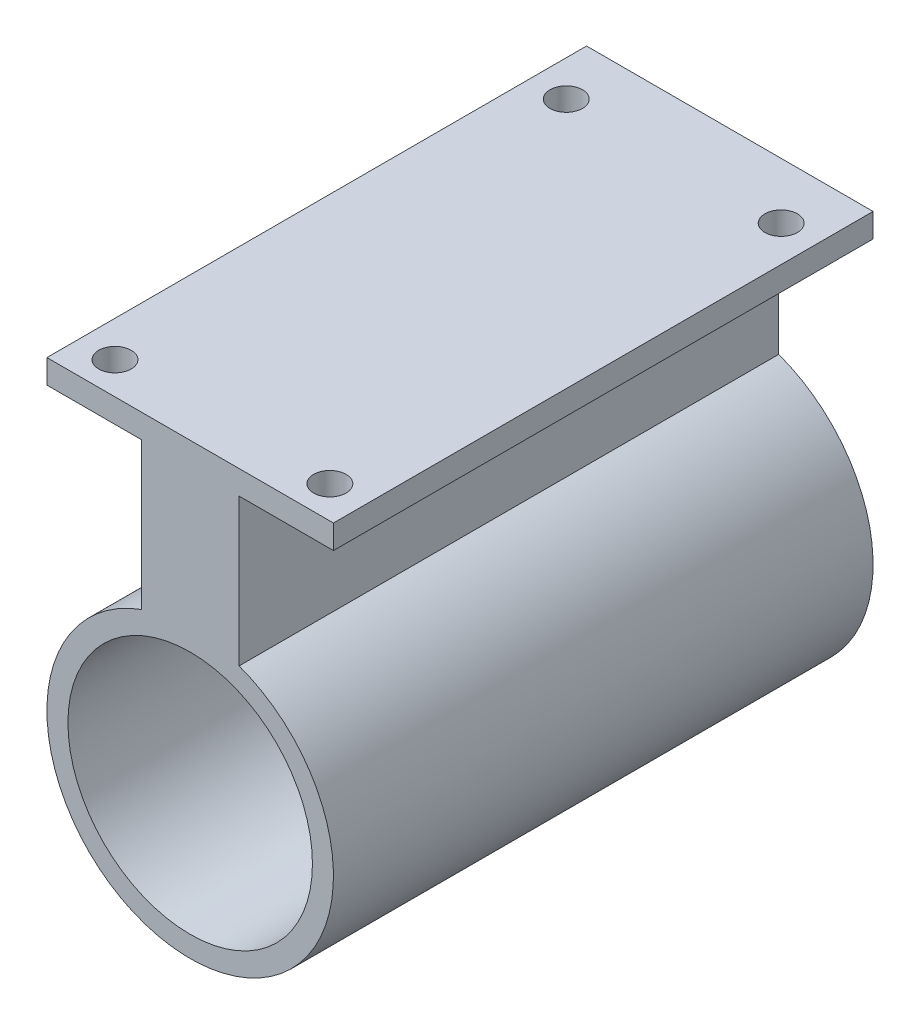
ISO-10303-21;
HEADER;
FILE_DESCRIPTION(('STEP AP214'),'2;1');
FILE_NAME('part.step','',(''),(''),'','','');
FILE_SCHEMA(('AUTOMOTIVE_DESIGN { 1 0 10303 214 1 1 1 1 }'));
ENDSEC;
DATA;
#1=APPLICATION_CONTEXT('core data for automotive mechanical design processes');
#2=APPLICATION_PROTOCOL_DEFINITION('international standard','automotive_design',2000,#1);
#3=PRODUCT_CONTEXT('',#1,'mechanical');
#4=PRODUCT('Part','Part','',(#3));
#5=PRODUCT_RELATED_PRODUCT_CATEGORY('part','',(#4));
#6=PRODUCT_DEFINITION_FORMATION('','',#4);
#7=PRODUCT_DEFINITION_CONTEXT('part definition',#1,'design');
#8=PRODUCT_DEFINITION('design','',#6,#7);
#9=PRODUCT_DEFINITION_SHAPE('','',#8);
#10=(LENGTH_UNIT() NAMED_UNIT(*) SI_UNIT(.MILLI.,.METRE.));
#11=(NAMED_UNIT(*) PLANE_ANGLE_UNIT() SI_UNIT($,.RADIAN.));
#12=(NAMED_UNIT(*) SI_UNIT($,.STERADIAN.) SOLID_ANGLE_UNIT());
#13=UNCERTAINTY_MEASURE_WITH_UNIT(LENGTH_MEASURE(1.E-05),#10,'distance_accuracy_value','');
#14=(GEOMETRIC_REPRESENTATION_CONTEXT(3) GLOBAL_UNCERTAINTY_ASSIGNED_CONTEXT((#13)) GLOBAL_UNIT_ASSIGNED_CONTEXT((#10,
#11,#12)) REPRESENTATION_CONTEXT('',''));
#15=CARTESIAN_POINT('',(0.,0.,0.));
#16=DIRECTION('',(0.,0.,1.));
#17=DIRECTION('',(1.,0.,0.));
#18=AXIS2_PLACEMENT_3D('',#15,#16,#17);
#19=CARTESIAN_POINT('',(0.,-30.75,54.));
#20=DIRECTION('',(0.,0.,-1.));
#21=DIRECTION('',(-1.,0.,0.));
#22=AXIS2_PLACEMENT_3D('',#19,#20,#21);
#23=CYLINDRICAL_SURFACE('',#22,15.);
#24=CARTESIAN_POINT('',(0.,-30.75,-2.5));
#25=DIRECTION('',(0.,0.,-1.));
#26=DIRECTION('',(-1.,0.,0.));
#27=AXIS2_PLACEMENT_3D('',#24,#25,#26);
#28=CIRCLE('',#27,15.);
#29=CARTESIAN_POINT('',(5.11989742878924,-16.6508280271969,-2.5));
#30=VERTEX_POINT('',#29);
#31=CARTESIAN_POINT('',(-5.11989742878925,-16.6508280271969,-2.5));
#32=VERTEX_POINT('',#31);
#33=EDGE_CURVE('E148',#30,#32,#28,.T.);
#34=ORIENTED_EDGE('',*,*,#33,.F.);
#35=DIRECTION('',(0.,0.,-1.));
#36=VECTOR('',#35,1.);
#37=CARTESIAN_POINT('',(5.11989742878925,-16.6508280271969,54.));
#38=LINE('',#37,#36);
#39=CARTESIAN_POINT('',(5.11989742878925,-16.6508280271969,54.));
#40=VERTEX_POINT('',#39);
#41=EDGE_CURVE('E49',#40,#30,#38,.T.);
#42=ORIENTED_EDGE('',*,*,#41,.F.);
#43=CARTESIAN_POINT('',(0.,-30.75,54.));
#44=DIRECTION('',(0.,0.,1.));
#45=DIRECTION('',(1.,0.,0.));
#46=AXIS2_PLACEMENT_3D('',#43,#44,#45);
#47=CIRCLE('',#46,15.);
#48=CARTESIAN_POINT('',(-5.11989742878925,-16.6508280271969,54.));
#49=VERTEX_POINT('',#48);
#50=EDGE_CURVE('E158',#49,#40,#47,.T.);
#51=ORIENTED_EDGE('',*,*,#50,.F.);
#52=DIRECTION('',(0.,0.,-1.));
#53=VECTOR('',#52,1.);
#54=CARTESIAN_POINT('',(-5.11989742878925,-16.6508280271969,54.));
#55=LINE('',#54,#53);
#56=EDGE_CURVE('E170',#49,#32,#55,.T.);
#57=ORIENTED_EDGE('',*,*,#56,.T.);
#58=EDGE_LOOP('',(#34,#42,#51,#57));
#59=FACE_BOUND('',#58,.T.);
#60=ADVANCED_FACE('F32',(#59),#23,.T.);
#61=CARTESIAN_POINT('',(0.,-30.75,54.));
#62=DIRECTION('',(0.,0.,1.));
#63=DIRECTION('',(1.,0.,0.));
#64=AXIS2_PLACEMENT_3D('',#61,#62,#63);
#65=PLANE('',#64);
#66=CARTESIAN_POINT('',(0.,-30.75,54.));
#67=DIRECTION('',(0.,0.,1.));
#68=DIRECTION('',(1.,0.,0.));
#69=AXIS2_PLACEMENT_3D('',#66,#67,#68);
#70=CIRCLE('',#69,12.8);
#71=CARTESIAN_POINT('',(12.8,-30.75,54.));
#72=VERTEX_POINT('',#71);
#73=EDGE_CURVE('E130',#72,#72,#70,.T.);
#74=ORIENTED_EDGE('',*,*,#73,.F.);
#75=EDGE_LOOP('',(#74));
#76=FACE_BOUND('',#75,.T.);
#77=DIRECTION('',(0.,-1.,0.));
#78=VECTOR('',#77,1.);
#79=CARTESIAN_POINT('',(-15.,-1.25,54.));
#80=LINE('',#79,#78);
#81=CARTESIAN_POINT('',(-15.,1.25,54.));
#82=VERTEX_POINT('',#81);
#83=CARTESIAN_POINT('',(-15.,-1.25,54.));
#84=VERTEX_POINT('',#83);
#85=EDGE_CURVE('E152',#82,#84,#80,.T.);
#86=ORIENTED_EDGE('',*,*,#85,.T.);
#87=DIRECTION('',(1.,0.,0.));
#88=VECTOR('',#87,1.);
#89=CARTESIAN_POINT('',(-5.11989742878925,-1.25,54.));
#90=LINE('',#89,#88);
#91=CARTESIAN_POINT('',(-5.11989742878925,-1.25,54.));
#92=VERTEX_POINT('',#91);
#93=EDGE_CURVE('E154',#84,#92,#90,.T.);
#94=ORIENTED_EDGE('',*,*,#93,.T.);
#95=DIRECTION('',(0.,-1.,0.));
#96=VECTOR('',#95,1.);
#97=CARTESIAN_POINT('',(-5.11989742878925,-13.25,54.));
#98=LINE('',#97,#96);
#99=EDGE_CURVE('E156',#92,#49,#98,.T.);
#100=ORIENTED_EDGE('',*,*,#99,.T.);
#101=ORIENTED_EDGE('',*,*,#50,.T.);
#102=DIRECTION('',(0.,1.,0.));
#103=VECTOR('',#102,1.);
#104=CARTESIAN_POINT('',(5.11989742878925,-13.25,54.));
#105=LINE('',#104,#103);
#106=CARTESIAN_POINT('',(5.11989742878925,-1.25,54.));
#107=VERTEX_POINT('',#106);
#108=EDGE_CURVE('E160',#40,#107,#105,.T.);
#109=ORIENTED_EDGE('',*,*,#108,.T.);
#110=DIRECTION('',(1.,0.,0.));
#111=VECTOR('',#110,1.);
#112=CARTESIAN_POINT('',(15.,-1.25,54.));
#113=LINE('',#112,#111);
#114=CARTESIAN_POINT('',(15.,-1.25,54.));
#115=VERTEX_POINT('',#114);
#116=EDGE_CURVE('E162',#107,#115,#113,.T.);
#117=ORIENTED_EDGE('',*,*,#116,.T.);
#118=DIRECTION('',(0.,1.,0.));
#119=VECTOR('',#118,1.);
#120=CARTESIAN_POINT('',(15.,-1.25,54.));
#121=LINE('',#120,#119);
#122=CARTESIAN_POINT('',(15.,1.25,54.));
#123=VERTEX_POINT('',#122);
#124=EDGE_CURVE('E108',#115,#123,#121,.T.);
#125=ORIENTED_EDGE('',*,*,#124,.T.);
#126=DIRECTION('',(-1.,0.,0.));
#127=VECTOR('',#126,1.);
#128=CARTESIAN_POINT('',(15.,1.25,54.));
#129=LINE('',#128,#127);
#130=EDGE_CURVE('E57',#123,#82,#129,.T.);
#131=ORIENTED_EDGE('',*,*,#130,.T.);
#132=EDGE_LOOP('',(#86,#94,#100,#101,#109,#117,#125,#131));
#133=FACE_BOUND('',#132,.T.);
#134=ADVANCED_FACE('F185',(#76,#133),#65,.T.);
#135=CARTESIAN_POINT('',(-15.,-1.25,54.));
#136=DIRECTION('',(1.,0.,0.));
#137=DIRECTION('',(0.,0.,-1.));
#138=AXIS2_PLACEMENT_3D('',#135,#136,#137);
#139=PLANE('',#138);
#140=DIRECTION('',(0.,0.,-1.));
#141=VECTOR('',#140,1.);
#142=CARTESIAN_POINT('',(-15.,1.25,54.));
#143=LINE('',#142,#141);
#144=CARTESIAN_POINT('',(-15.,1.25,-2.5));
#145=VERTEX_POINT('',#144);
#146=EDGE_CURVE('E166',#82,#145,#143,.T.);
#147=ORIENTED_EDGE('',*,*,#146,.T.);
#148=DIRECTION('',(0.,1.,0.));
#149=VECTOR('',#148,1.);
#150=CARTESIAN_POINT('',(-15.,1.25,-2.5));
#151=LINE('',#150,#149);
#152=CARTESIAN_POINT('',(-15.,-1.25,-2.5));
#153=VERTEX_POINT('',#152);
#154=EDGE_CURVE('E141',#153,#145,#151,.T.);
#155=ORIENTED_EDGE('',*,*,#154,.F.);
#156=DIRECTION('',(0.,0.,-1.));
#157=VECTOR('',#156,1.);
#158=CARTESIAN_POINT('',(-15.,-1.25,54.));
#159=LINE('',#158,#157);
#160=EDGE_CURVE('E11',#84,#153,#159,.T.);
#161=ORIENTED_EDGE('',*,*,#160,.F.);
#162=ORIENTED_EDGE('',*,*,#85,.F.);
#163=EDGE_LOOP('',(#147,#155,#161,#162));
#164=FACE_BOUND('',#163,.T.);
#165=ADVANCED_FACE('F34',(#164),#139,.F.);
#166=CARTESIAN_POINT('',(-5.11989742878925,-1.25,54.));
#167=DIRECTION('',(0.,1.,0.));
#168=DIRECTION('',(-1.,0.,0.));
#169=AXIS2_PLACEMENT_3D('',#166,#167,#168);
#170=PLANE('',#169);
#171=CARTESIAN_POINT('',(-11.25,-1.25,50.625));
#172=DIRECTION('',(0.,1.,0.));
#173=DIRECTION('',(-1.,0.,0.));
#174=AXIS2_PLACEMENT_3D('',#171,#172,#173);
#175=CIRCLE('',#174,1.7);
#176=CARTESIAN_POINT('',(-12.95,-1.25,50.625));
#177=VERTEX_POINT('',#176);
#178=EDGE_CURVE('E226',#177,#177,#175,.T.);
#179=ORIENTED_EDGE('',*,*,#178,.T.);
#180=EDGE_LOOP('',(#179));
#181=FACE_BOUND('',#180,.T.);
#182=CARTESIAN_POINT('',(-11.25,-1.25,3.375));
#183=DIRECTION('',(0.,1.,0.));
#184=DIRECTION('',(-1.,0.,0.));
#185=AXIS2_PLACEMENT_3D('',#182,#183,#184);
#186=CIRCLE('',#185,1.7);
#187=CARTESIAN_POINT('',(-12.95,-1.25,3.375));
#188=VERTEX_POINT('',#187);
#189=EDGE_CURVE('E229',#188,#188,#186,.T.);
#190=ORIENTED_EDGE('',*,*,#189,.T.);
#191=EDGE_LOOP('',(#190));
#192=FACE_BOUND('',#191,.T.);
#193=ORIENTED_EDGE('',*,*,#160,.T.);
#194=DIRECTION('',(-1.,0.,0.));
#195=VECTOR('',#194,1.);
#196=CARTESIAN_POINT('',(-15.,-1.25,-2.5));
#197=LINE('',#196,#195);
#198=CARTESIAN_POINT('',(-5.11989742878925,-1.25,-2.5));
#199=VERTEX_POINT('',#198);
#200=EDGE_CURVE('E138',#199,#153,#197,.T.);
#201=ORIENTED_EDGE('',*,*,#200,.F.);
#202=DIRECTION('',(0.,0.,-1.));
#203=VECTOR('',#202,1.);
#204=CARTESIAN_POINT('',(-5.11989742878925,-1.25,54.));
#205=LINE('',#204,#203);
#206=EDGE_CURVE('E41',#92,#199,#205,.T.);
#207=ORIENTED_EDGE('',*,*,#206,.F.);
#208=ORIENTED_EDGE('',*,*,#93,.F.);
#209=EDGE_LOOP('',(#193,#201,#207,#208));
#210=FACE_BOUND('',#209,.T.);
#211=ADVANCED_FACE('F189',(#181,#192,#210),#170,.F.);
#212=CARTESIAN_POINT('',(-5.11989742878925,-13.25,54.));
#213=DIRECTION('',(1.,0.,0.));
#214=DIRECTION('',(0.,0.,-1.));
#215=AXIS2_PLACEMENT_3D('',#212,#213,#214);
#216=PLANE('',#215);
#217=ORIENTED_EDGE('',*,*,#206,.T.);
#218=DIRECTION('',(0.,1.,0.));
#219=VECTOR('',#218,1.);
#220=CARTESIAN_POINT('',(-5.11989742878925,-1.25,-2.5));
#221=LINE('',#220,#219);
#222=EDGE_CURVE('E135',#32,#199,#221,.T.);
#223=ORIENTED_EDGE('',*,*,#222,.F.);
#224=ORIENTED_EDGE('',*,*,#56,.F.);
#225=ORIENTED_EDGE('',*,*,#99,.F.);
#226=EDGE_LOOP('',(#217,#223,#224,#225));
#227=FACE_BOUND('',#226,.T.);
#228=ADVANCED_FACE('F181',(#227),#216,.F.);
#229=CARTESIAN_POINT('',(5.11989742878925,-13.25,54.));
#230=DIRECTION('',(-1.,0.,0.));
#231=DIRECTION('',(0.,0.,1.));
#232=AXIS2_PLACEMENT_3D('',#229,#230,#231);
#233=PLANE('',#232);
#234=ORIENTED_EDGE('',*,*,#41,.T.);
#235=DIRECTION('',(0.,-1.,0.));
#236=VECTOR('',#235,1.);
#237=CARTESIAN_POINT('',(5.11989742878925,-1.25,-2.5));
#238=LINE('',#237,#236);
#239=CARTESIAN_POINT('',(5.11989742878925,-1.25,-2.5));
#240=VERTEX_POINT('',#239);
#241=EDGE_CURVE('E119',#240,#30,#238,.T.);
#242=ORIENTED_EDGE('',*,*,#241,.F.);
#243=DIRECTION('',(0.,0.,-1.));
#244=VECTOR('',#243,1.);
#245=CARTESIAN_POINT('',(5.11989742878925,-1.25,54.));
#246=LINE('',#245,#244);
#247=EDGE_CURVE('E111',#107,#240,#246,.T.);
#248=ORIENTED_EDGE('',*,*,#247,.F.);
#249=ORIENTED_EDGE('',*,*,#108,.F.);
#250=EDGE_LOOP('',(#234,#242,#248,#249));
#251=FACE_BOUND('',#250,.T.);
#252=ADVANCED_FACE('F184',(#251),#233,.F.);
#253=CARTESIAN_POINT('',(15.,-1.25,54.));
#254=DIRECTION('',(0.,1.,0.));
#255=DIRECTION('',(-1.,0.,0.));
#256=AXIS2_PLACEMENT_3D('',#253,#254,#255);
#257=PLANE('',#256);
#258=CARTESIAN_POINT('',(11.25,-1.25,3.375));
#259=DIRECTION('',(0.,1.,0.));
#260=DIRECTION('',(1.,0.,0.));
#261=AXIS2_PLACEMENT_3D('',#258,#259,#260);
#262=CIRCLE('',#261,1.7);
#263=CARTESIAN_POINT('',(12.95,-1.25,3.375));
#264=VERTEX_POINT('',#263);
#265=EDGE_CURVE('E298',#264,#264,#262,.T.);
#266=ORIENTED_EDGE('',*,*,#265,.T.);
#267=EDGE_LOOP('',(#266));
#268=FACE_BOUND('',#267,.T.);
#269=CARTESIAN_POINT('',(11.25,-1.25,50.625));
#270=DIRECTION('',(0.,1.,0.));
#271=DIRECTION('',(1.,0.,0.));
#272=AXIS2_PLACEMENT_3D('',#269,#270,#271);
#273=CIRCLE('',#272,1.7);
#274=CARTESIAN_POINT('',(12.95,-1.25,50.625));
#275=VERTEX_POINT('',#274);
#276=EDGE_CURVE('E305',#275,#275,#273,.T.);
#277=ORIENTED_EDGE('',*,*,#276,.T.);
#278=EDGE_LOOP('',(#277));
#279=FACE_BOUND('',#278,.T.);
#280=ORIENTED_EDGE('',*,*,#247,.T.);
#281=DIRECTION('',(-1.,0.,0.));
#282=VECTOR('',#281,1.);
#283=CARTESIAN_POINT('',(15.,-1.25,-2.5));
#284=LINE('',#283,#282);
#285=CARTESIAN_POINT('',(15.,-1.25,-2.5));
#286=VERTEX_POINT('',#285);
#287=EDGE_CURVE('E115',#286,#240,#284,.T.);
#288=ORIENTED_EDGE('',*,*,#287,.F.);
#289=DIRECTION('',(0.,0.,-1.));
#290=VECTOR('',#289,1.);
#291=CARTESIAN_POINT('',(15.,-1.25,54.));
#292=LINE('',#291,#290);
#293=EDGE_CURVE('E102',#115,#286,#292,.T.);
#294=ORIENTED_EDGE('',*,*,#293,.F.);
#295=ORIENTED_EDGE('',*,*,#116,.F.);
#296=EDGE_LOOP('',(#280,#288,#294,#295));
#297=FACE_BOUND('',#296,.T.);
#298=ADVANCED_FACE('F116',(#268,#279,#297),#257,.F.);
#299=CARTESIAN_POINT('',(15.,-1.25,54.));
#300=DIRECTION('',(-1.,0.,0.));
#301=DIRECTION('',(0.,0.,1.));
#302=AXIS2_PLACEMENT_3D('',#299,#300,#301);
#303=PLANE('',#302);
#304=ORIENTED_EDGE('',*,*,#293,.T.);
#305=DIRECTION('',(0.,-1.,0.));
#306=VECTOR('',#305,1.);
#307=CARTESIAN_POINT('',(15.,1.25,-2.5));
#308=LINE('',#307,#306);
#309=CARTESIAN_POINT('',(15.,1.25,-2.5));
#310=VERTEX_POINT('',#309);
#311=EDGE_CURVE('E107',#310,#286,#308,.T.);
#312=ORIENTED_EDGE('',*,*,#311,.F.);
#313=DIRECTION('',(0.,0.,-1.));
#314=VECTOR('',#313,1.);
#315=CARTESIAN_POINT('',(15.,1.25,54.));
#316=LINE('',#315,#314);
#317=EDGE_CURVE('E112',#123,#310,#316,.T.);
#318=ORIENTED_EDGE('',*,*,#317,.F.);
#319=ORIENTED_EDGE('',*,*,#124,.F.);
#320=EDGE_LOOP('',(#304,#312,#318,#319));
#321=FACE_BOUND('',#320,.T.);
#322=ADVANCED_FACE('F104',(#321),#303,.F.);
#323=CARTESIAN_POINT('',(15.,1.25,54.));
#324=DIRECTION('',(0.,-1.,0.));
#325=DIRECTION('',(1.,0.,0.));
#326=AXIS2_PLACEMENT_3D('',#323,#324,#325);
#327=PLANE('',#326);
#328=CARTESIAN_POINT('',(11.25,1.25,3.375));
#329=DIRECTION('',(0.,1.,0.));
#330=DIRECTION('',(1.,0.,0.));
#331=AXIS2_PLACEMENT_3D('',#328,#329,#330);
#332=CIRCLE('',#331,1.7);
#333=CARTESIAN_POINT('',(12.95,1.25,3.375));
#334=VERTEX_POINT('',#333);
#335=EDGE_CURVE('E300',#334,#334,#332,.T.);
#336=ORIENTED_EDGE('',*,*,#335,.F.);
#337=EDGE_LOOP('',(#336));
#338=FACE_BOUND('',#337,.T.);
#339=CARTESIAN_POINT('',(11.25,1.25,50.625));
#340=DIRECTION('',(0.,1.,0.));
#341=DIRECTION('',(1.,0.,0.));
#342=AXIS2_PLACEMENT_3D('',#339,#340,#341);
#343=CIRCLE('',#342,1.7);
#344=CARTESIAN_POINT('',(12.95,1.25,50.625));
#345=VERTEX_POINT('',#344);
#346=EDGE_CURVE('E302',#345,#345,#343,.T.);
#347=ORIENTED_EDGE('',*,*,#346,.F.);
#348=EDGE_LOOP('',(#347));
#349=FACE_BOUND('',#348,.T.);
#350=CARTESIAN_POINT('',(-11.25,1.25,50.625));
#351=DIRECTION('',(0.,1.,0.));
#352=DIRECTION('',(-1.,0.,0.));
#353=AXIS2_PLACEMENT_3D('',#350,#351,#352);
#354=CIRCLE('',#353,1.7);
#355=CARTESIAN_POINT('',(-12.95,1.25,50.625));
#356=VERTEX_POINT('',#355);
#357=EDGE_CURVE('E240',#356,#356,#354,.T.);
#358=ORIENTED_EDGE('',*,*,#357,.F.);
#359=EDGE_LOOP('',(#358));
#360=FACE_BOUND('',#359,.T.);
#361=CARTESIAN_POINT('',(-11.25,1.25,3.375));
#362=DIRECTION('',(0.,1.,0.));
#363=DIRECTION('',(-1.,0.,0.));
#364=AXIS2_PLACEMENT_3D('',#361,#362,#363);
#365=CIRCLE('',#364,1.7);
#366=CARTESIAN_POINT('',(-12.95,1.25,3.375));
#367=VERTEX_POINT('',#366);
#368=EDGE_CURVE('E232',#367,#367,#365,.T.);
#369=ORIENTED_EDGE('',*,*,#368,.F.);
#370=EDGE_LOOP('',(#369));
#371=FACE_BOUND('',#370,.T.);
#372=ORIENTED_EDGE('',*,*,#317,.T.);
#373=DIRECTION('',(1.,0.,0.));
#374=VECTOR('',#373,1.);
#375=CARTESIAN_POINT('',(15.,1.25,-2.5));
#376=LINE('',#375,#374);
#377=EDGE_CURVE('E126',#145,#310,#376,.T.);
#378=ORIENTED_EDGE('',*,*,#377,.F.);
#379=ORIENTED_EDGE('',*,*,#146,.F.);
#380=ORIENTED_EDGE('',*,*,#130,.F.);
#381=EDGE_LOOP('',(#372,#378,#379,#380));
#382=FACE_BOUND('',#381,.T.);
#383=ADVANCED_FACE('F193',(#338,#349,#360,#371,#382),#327,.F.);
#384=CARTESIAN_POINT('',(0.,-30.75,-2.5));
#385=DIRECTION('',(0.,0.,-1.));
#386=DIRECTION('',(-1.,0.,0.));
#387=AXIS2_PLACEMENT_3D('',#384,#385,#386);
#388=PLANE('',#387);
#389=CARTESIAN_POINT('',(0.,-39.25,-2.5));
#390=DIRECTION('',(0.,0.,-1.));
#391=DIRECTION('',(-1.,0.,0.));
#392=AXIS2_PLACEMENT_3D('',#389,#390,#391);
#393=CIRCLE('',#392,1.7);
#394=CARTESIAN_POINT('',(-1.69999999999999,-39.25,-2.5));
#395=VERTEX_POINT('',#394);
#396=EDGE_CURVE('E231',#395,#395,#393,.T.);
#397=ORIENTED_EDGE('',*,*,#396,.F.);
#398=EDGE_LOOP('',(#397));
#399=FACE_BOUND('',#398,.T.);
#400=CARTESIAN_POINT('',(0.,-22.25,-2.5));
#401=DIRECTION('',(0.,0.,-1.));
#402=DIRECTION('',(-1.,0.,0.));
#403=AXIS2_PLACEMENT_3D('',#400,#401,#402);
#404=CIRCLE('',#403,1.7);
#405=CARTESIAN_POINT('',(-1.7,-22.25,-2.5));
#406=VERTEX_POINT('',#405);
#407=EDGE_CURVE('E244',#406,#406,#404,.T.);
#408=ORIENTED_EDGE('',*,*,#407,.F.);
#409=EDGE_LOOP('',(#408));
#410=FACE_BOUND('',#409,.T.);
#411=CARTESIAN_POINT('',(0.,-30.75,-2.5));
#412=DIRECTION('',(0.,0.,-1.));
#413=DIRECTION('',(-1.,0.,0.));
#414=AXIS2_PLACEMENT_3D('',#411,#412,#413);
#415=CIRCLE('',#414,3.75);
#416=CARTESIAN_POINT('',(-3.74999999999999,-30.75,-2.5));
#417=VERTEX_POINT('',#416);
#418=EDGE_CURVE('E144',#417,#417,#415,.T.);
#419=ORIENTED_EDGE('',*,*,#418,.F.);
#420=EDGE_LOOP('',(#419));
#421=FACE_BOUND('',#420,.T.);
#422=ORIENTED_EDGE('',*,*,#33,.T.);
#423=ORIENTED_EDGE('',*,*,#222,.T.);
#424=ORIENTED_EDGE('',*,*,#200,.T.);
#425=ORIENTED_EDGE('',*,*,#154,.T.);
#426=ORIENTED_EDGE('',*,*,#377,.T.);
#427=ORIENTED_EDGE('',*,*,#311,.T.);
#428=ORIENTED_EDGE('',*,*,#287,.T.);
#429=ORIENTED_EDGE('',*,*,#241,.T.);
#430=EDGE_LOOP('',(#422,#423,#424,#425,#426,#427,#428,#429));
#431=FACE_BOUND('',#430,.T.);
#432=ADVANCED_FACE('F123',(#399,#410,#421,#431),#388,.T.);
#433=CARTESIAN_POINT('',(0.,-30.75,0.));
#434=DIRECTION('',(0.,0.,-1.));
#435=DIRECTION('',(-1.,0.,0.));
#436=AXIS2_PLACEMENT_3D('',#433,#434,#435);
#437=PLANE('',#436);
#438=CARTESIAN_POINT('',(0.,-39.25,0.));
#439=DIRECTION('',(0.,0.,-1.));
#440=DIRECTION('',(-1.,0.,0.));
#441=AXIS2_PLACEMENT_3D('',#438,#439,#440);
#442=CIRCLE('',#441,1.7);
#443=CARTESIAN_POINT('',(-1.69999999999999,-39.25,0.));
#444=VERTEX_POINT('',#443);
#445=EDGE_CURVE('E235',#444,#444,#442,.T.);
#446=ORIENTED_EDGE('',*,*,#445,.T.);
#447=EDGE_LOOP('',(#446));
#448=FACE_BOUND('',#447,.T.);
#449=CARTESIAN_POINT('',(0.,-22.25,0.));
#450=DIRECTION('',(0.,0.,-1.));
#451=DIRECTION('',(-1.,0.,0.));
#452=AXIS2_PLACEMENT_3D('',#449,#450,#451);
#453=CIRCLE('',#452,1.7);
#454=CARTESIAN_POINT('',(-1.7,-22.25,0.));
#455=VERTEX_POINT('',#454);
#456=EDGE_CURVE('E246',#455,#455,#453,.T.);
#457=ORIENTED_EDGE('',*,*,#456,.T.);
#458=EDGE_LOOP('',(#457));
#459=FACE_BOUND('',#458,.T.);
#460=CARTESIAN_POINT('',(0.,-30.75,0.));
#461=DIRECTION('',(0.,0.,-1.));
#462=DIRECTION('',(-1.,0.,0.));
#463=AXIS2_PLACEMENT_3D('',#460,#461,#462);
#464=CIRCLE('',#463,3.75);
#465=CARTESIAN_POINT('',(-3.74999999999999,-30.75,0.));
#466=VERTEX_POINT('',#465);
#467=EDGE_CURVE('E145',#466,#466,#464,.T.);
#468=ORIENTED_EDGE('',*,*,#467,.T.);
#469=EDGE_LOOP('',(#468));
#470=FACE_BOUND('',#469,.T.);
#471=CARTESIAN_POINT('',(0.,-30.75,0.));
#472=DIRECTION('',(0.,0.,1.));
#473=DIRECTION('',(1.,0.,0.));
#474=AXIS2_PLACEMENT_3D('',#471,#472,#473);
#475=CIRCLE('',#474,12.8);
#476=CARTESIAN_POINT('',(12.8,-30.75,0.));
#477=VERTEX_POINT('',#476);
#478=EDGE_CURVE('E127',#477,#477,#475,.T.);
#479=ORIENTED_EDGE('',*,*,#478,.T.);
#480=EDGE_LOOP('',(#479));
#481=FACE_BOUND('',#480,.T.);
#482=ADVANCED_FACE('F201',(#448,#459,#470,#481),#437,.F.);
#483=CARTESIAN_POINT('',(0.,-30.75,0.));
#484=DIRECTION('',(0.,0.,-1.));
#485=DIRECTION('',(-1.,0.,0.));
#486=AXIS2_PLACEMENT_3D('',#483,#484,#485);
#487=CYLINDRICAL_SURFACE('',#486,3.75);
#488=ORIENTED_EDGE('',*,*,#467,.F.);
#489=EDGE_LOOP('',(#488));
#490=FACE_BOUND('',#489,.T.);
#491=ORIENTED_EDGE('',*,*,#418,.T.);
#492=EDGE_LOOP('',(#491));
#493=FACE_BOUND('',#492,.T.);
#494=ADVANCED_FACE('F257',(#490,#493),#487,.F.);
#495=CARTESIAN_POINT('',(0.,-30.75,0.));
#496=DIRECTION('',(0.,0.,1.));
#497=DIRECTION('',(1.,0.,0.));
#498=AXIS2_PLACEMENT_3D('',#495,#496,#497);
#499=CYLINDRICAL_SURFACE('',#498,12.8);
#500=ORIENTED_EDGE('',*,*,#478,.F.);
#501=EDGE_LOOP('',(#500));
#502=FACE_BOUND('',#501,.T.);
#503=ORIENTED_EDGE('',*,*,#73,.T.);
#504=EDGE_LOOP('',(#503));
#505=FACE_BOUND('',#504,.T.);
#506=ADVANCED_FACE('F259',(#502,#505),#499,.F.);
#507=CARTESIAN_POINT('',(0.,-22.25,0.));
#508=DIRECTION('',(0.,0.,-1.));
#509=DIRECTION('',(-1.,0.,0.));
#510=AXIS2_PLACEMENT_3D('',#507,#508,#509);
#511=CYLINDRICAL_SURFACE('',#510,1.7);
#512=ORIENTED_EDGE('',*,*,#456,.F.);
#513=EDGE_LOOP('',(#512));
#514=FACE_BOUND('',#513,.T.);
#515=ORIENTED_EDGE('',*,*,#407,.T.);
#516=EDGE_LOOP('',(#515));
#517=FACE_BOUND('',#516,.T.);
#518=ADVANCED_FACE('F252',(#514,#517),#511,.F.);
#519=CARTESIAN_POINT('',(0.,-39.25,0.));
#520=DIRECTION('',(0.,0.,-1.));
#521=DIRECTION('',(-1.,0.,0.));
#522=AXIS2_PLACEMENT_3D('',#519,#520,#521);
#523=CYLINDRICAL_SURFACE('',#522,1.7);
#524=ORIENTED_EDGE('',*,*,#445,.F.);
#525=EDGE_LOOP('',(#524));
#526=FACE_BOUND('',#525,.T.);
#527=ORIENTED_EDGE('',*,*,#396,.T.);
#528=EDGE_LOOP('',(#527));
#529=FACE_BOUND('',#528,.T.);
#530=ADVANCED_FACE('F274',(#526,#529),#523,.F.);
#531=CARTESIAN_POINT('',(-11.25,-1.25,3.375));
#532=DIRECTION('',(0.,1.,0.));
#533=DIRECTION('',(-1.,0.,0.));
#534=AXIS2_PLACEMENT_3D('',#531,#532,#533);
#535=CYLINDRICAL_SURFACE('',#534,1.7);
#536=ORIENTED_EDGE('',*,*,#189,.F.);
#537=EDGE_LOOP('',(#536));
#538=FACE_BOUND('',#537,.T.);
#539=ORIENTED_EDGE('',*,*,#368,.T.);
#540=EDGE_LOOP('',(#539));
#541=FACE_BOUND('',#540,.T.);
#542=ADVANCED_FACE('F278',(#538,#541),#535,.F.);
#543=CARTESIAN_POINT('',(-11.25,-1.25,50.625));
#544=DIRECTION('',(0.,1.,0.));
#545=DIRECTION('',(-1.,0.,0.));
#546=AXIS2_PLACEMENT_3D('',#543,#544,#545);
#547=CYLINDRICAL_SURFACE('',#546,1.7);
#548=ORIENTED_EDGE('',*,*,#178,.F.);
#549=EDGE_LOOP('',(#548));
#550=FACE_BOUND('',#549,.T.);
#551=ORIENTED_EDGE('',*,*,#357,.T.);
#552=EDGE_LOOP('',(#551));
#553=FACE_BOUND('',#552,.T.);
#554=ADVANCED_FACE('F282',(#550,#553),#547,.F.);
#555=CARTESIAN_POINT('',(11.25,-1.25,50.625));
#556=DIRECTION('',(0.,1.,0.));
#557=DIRECTION('',(-1.,0.,0.));
#558=AXIS2_PLACEMENT_3D('',#555,#556,#557);
#559=CYLINDRICAL_SURFACE('',#558,1.7);
#560=ORIENTED_EDGE('',*,*,#276,.F.);
#561=EDGE_LOOP('',(#560));
#562=FACE_BOUND('',#561,.T.);
#563=ORIENTED_EDGE('',*,*,#346,.T.);
#564=EDGE_LOOP('',(#563));
#565=FACE_BOUND('',#564,.T.);
#566=ADVANCED_FACE('F285',(#562,#565),#559,.F.);
#567=CARTESIAN_POINT('',(11.25,-1.25,3.375));
#568=DIRECTION('',(0.,1.,0.));
#569=DIRECTION('',(-1.,0.,0.));
#570=AXIS2_PLACEMENT_3D('',#567,#568,#569);
#571=CYLINDRICAL_SURFACE('',#570,1.7);
#572=ORIENTED_EDGE('',*,*,#265,.F.);
#573=EDGE_LOOP('',(#572));
#574=FACE_BOUND('',#573,.T.);
#575=ORIENTED_EDGE('',*,*,#335,.T.);
#576=EDGE_LOOP('',(#575));
#577=FACE_BOUND('',#576,.T.);
#578=ADVANCED_FACE('F289',(#574,#577),#571,.F.);
#579=CLOSED_SHELL('',(#60,#134,#165,#211,#228,#252,#298,#322,#383,#432,#482,#494,#506,#518,#530,
#542,#554,#566,#578));
#580=MANIFOLD_SOLID_BREP('B2',#579);
#581=ADVANCED_BREP_SHAPE_REPRESENTATION('',(#18,#580),#14);
#582=SHAPE_DEFINITION_REPRESENTATION(#9,#581);
ENDSEC;
END-ISO-10303-21;
